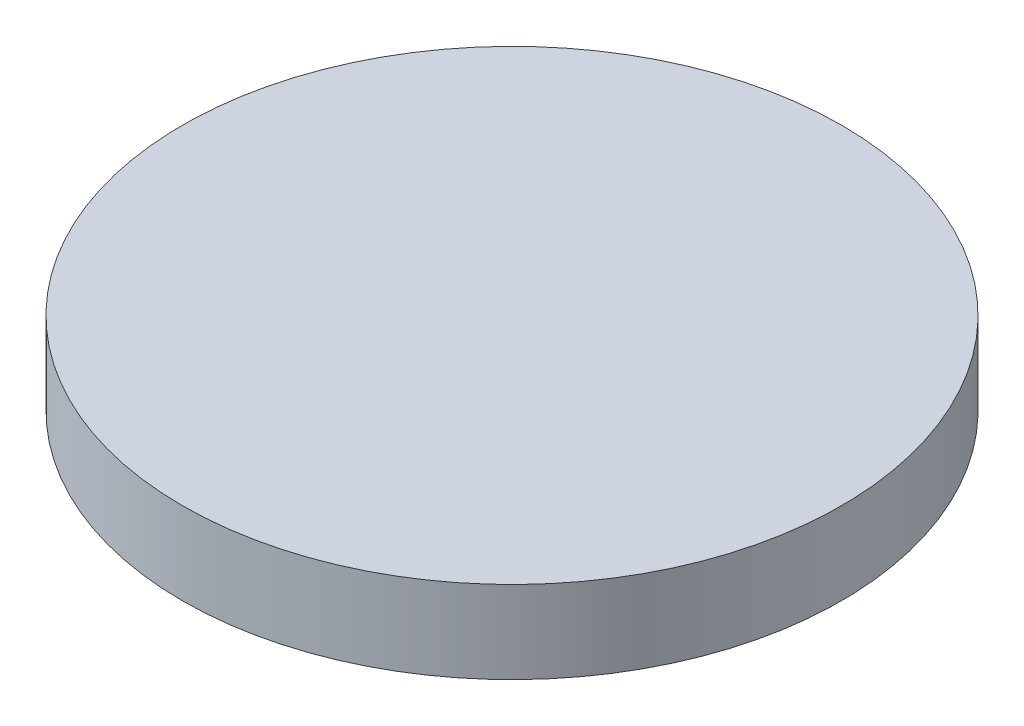
ISO-10303-21;
HEADER;
FILE_DESCRIPTION(('STEP AP214'),'2;1');
FILE_NAME('part.step','',(''),(''),'','','');
FILE_SCHEMA(('AUTOMOTIVE_DESIGN { 1 0 10303 214 1 1 1 1 }'));
ENDSEC;
DATA;
#1=APPLICATION_CONTEXT('core data for automotive mechanical design processes');
#2=APPLICATION_PROTOCOL_DEFINITION('international standard','automotive_design',2000,#1);
#3=PRODUCT_CONTEXT('',#1,'mechanical');
#4=PRODUCT('Part','Part','',(#3));
#5=PRODUCT_RELATED_PRODUCT_CATEGORY('part','',(#4));
#6=PRODUCT_DEFINITION_FORMATION('','',#4);
#7=PRODUCT_DEFINITION_CONTEXT('part definition',#1,'design');
#8=PRODUCT_DEFINITION('design','',#6,#7);
#9=PRODUCT_DEFINITION_SHAPE('','',#8);
#10=(LENGTH_UNIT() NAMED_UNIT(*) SI_UNIT(.MILLI.,.METRE.));
#11=(NAMED_UNIT(*) PLANE_ANGLE_UNIT() SI_UNIT($,.RADIAN.));
#12=(NAMED_UNIT(*) SI_UNIT($,.STERADIAN.) SOLID_ANGLE_UNIT());
#13=UNCERTAINTY_MEASURE_WITH_UNIT(LENGTH_MEASURE(1.E-05),#10,'distance_accuracy_value','');
#14=(GEOMETRIC_REPRESENTATION_CONTEXT(3) GLOBAL_UNCERTAINTY_ASSIGNED_CONTEXT((#13)) GLOBAL_UNIT_ASSIGNED_CONTEXT((#10,
#11,#12)) REPRESENTATION_CONTEXT('',''));
#15=CARTESIAN_POINT('',(0.,0.,0.));
#16=DIRECTION('',(0.,0.,1.));
#17=DIRECTION('',(1.,0.,0.));
#18=AXIS2_PLACEMENT_3D('',#15,#16,#17);
#19=CARTESIAN_POINT('',(0.,1.,0.));
#20=DIRECTION('',(0.,-1.,0.));
#21=DIRECTION('',(0.,0.,-1.));
#22=AXIS2_PLACEMENT_3D('',#19,#20,#21);
#23=CYLINDRICAL_SURFACE('',#22,4.);
#24=CARTESIAN_POINT('',(0.,1.,0.));
#25=DIRECTION('',(0.,1.,0.));
#26=DIRECTION('',(0.,0.,1.));
#27=AXIS2_PLACEMENT_3D('',#24,#25,#26);
#28=CIRCLE('',#27,4.);
#29=CARTESIAN_POINT('',(0.,1.,4.));
#30=VERTEX_POINT('',#29);
#31=EDGE_CURVE('E10',#30,#30,#28,.T.);
#32=ORIENTED_EDGE('',*,*,#31,.F.);
#33=EDGE_LOOP('',(#32));
#34=FACE_BOUND('',#33,.T.);
#35=CARTESIAN_POINT('',(0.,0.,0.));
#36=DIRECTION('',(0.,1.,0.));
#37=DIRECTION('',(0.,0.,1.));
#38=AXIS2_PLACEMENT_3D('',#35,#36,#37);
#39=CIRCLE('',#38,4.);
#40=CARTESIAN_POINT('',(0.,0.,4.));
#41=VERTEX_POINT('',#40);
#42=EDGE_CURVE('E40',#41,#41,#39,.T.);
#43=ORIENTED_EDGE('',*,*,#42,.T.);
#44=EDGE_LOOP('',(#43));
#45=FACE_BOUND('',#44,.T.);
#46=ADVANCED_FACE('F37',(#34,#45),#23,.T.);
#47=CARTESIAN_POINT('',(0.,1.,0.));
#48=DIRECTION('',(0.,1.,0.));
#49=DIRECTION('',(0.,0.,1.));
#50=AXIS2_PLACEMENT_3D('',#47,#48,#49);
#51=PLANE('',#50);
#52=ORIENTED_EDGE('',*,*,#31,.T.);
#53=EDGE_LOOP('',(#52));
#54=FACE_BOUND('',#53,.T.);
#55=ADVANCED_FACE('F54',(#54),#51,.T.);
#56=CARTESIAN_POINT('',(0.,0.,0.));
#57=DIRECTION('',(0.,1.,0.));
#58=DIRECTION('',(0.,0.,1.));
#59=AXIS2_PLACEMENT_3D('',#56,#57,#58);
#60=PLANE('',#59);
#61=ORIENTED_EDGE('',*,*,#42,.F.);
#62=EDGE_LOOP('',(#61));
#63=FACE_BOUND('',#62,.T.);
#64=ADVANCED_FACE('F52',(#63),#60,.F.);
#65=CLOSED_SHELL('',(#46,#55,#64));
#66=MANIFOLD_SOLID_BREP('B2',#65);
#67=ADVANCED_BREP_SHAPE_REPRESENTATION('',(#18,#66),#14);
#68=SHAPE_DEFINITION_REPRESENTATION(#9,#67);
ENDSEC;
END-ISO-10303-21;
